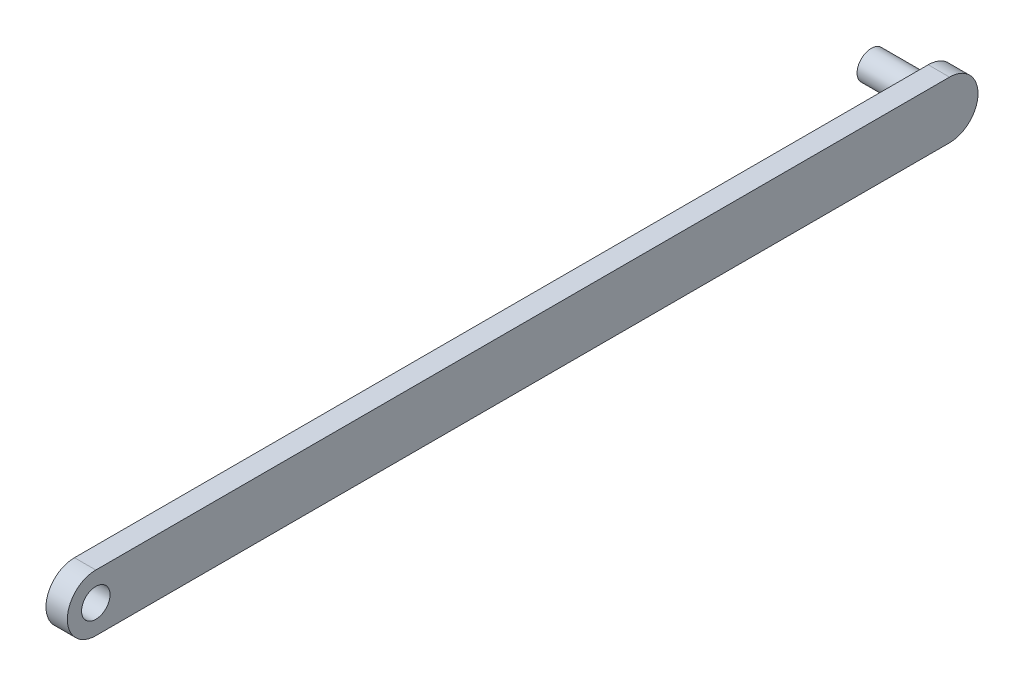
ISO-10303-21;
HEADER;
FILE_DESCRIPTION(('STEP AP214'),'2;1');
FILE_NAME('part.step','',(''),(''),'','','');
FILE_SCHEMA(('AUTOMOTIVE_DESIGN { 1 0 10303 214 1 1 1 1 }'));
ENDSEC;
DATA;
#1=APPLICATION_CONTEXT('core data for automotive mechanical design processes');
#2=APPLICATION_PROTOCOL_DEFINITION('international standard','automotive_design',2000,#1);
#3=PRODUCT_CONTEXT('',#1,'mechanical');
#4=PRODUCT('Part','Part','',(#3));
#5=PRODUCT_RELATED_PRODUCT_CATEGORY('part','',(#4));
#6=PRODUCT_DEFINITION_FORMATION('','',#4);
#7=PRODUCT_DEFINITION_CONTEXT('part definition',#1,'design');
#8=PRODUCT_DEFINITION('design','',#6,#7);
#9=PRODUCT_DEFINITION_SHAPE('','',#8);
#10=(LENGTH_UNIT() NAMED_UNIT(*) SI_UNIT(.MILLI.,.METRE.));
#11=(NAMED_UNIT(*) PLANE_ANGLE_UNIT() SI_UNIT($,.RADIAN.));
#12=(NAMED_UNIT(*) SI_UNIT($,.STERADIAN.) SOLID_ANGLE_UNIT());
#13=UNCERTAINTY_MEASURE_WITH_UNIT(LENGTH_MEASURE(1.E-05),#10,'distance_accuracy_value','');
#14=(GEOMETRIC_REPRESENTATION_CONTEXT(3) GLOBAL_UNCERTAINTY_ASSIGNED_CONTEXT((#13)) GLOBAL_UNIT_ASSIGNED_CONTEXT((#10,
#11,#12)) REPRESENTATION_CONTEXT('',''));
#15=CARTESIAN_POINT('',(0.,0.,0.));
#16=DIRECTION('',(0.,0.,1.));
#17=DIRECTION('',(1.,0.,0.));
#18=AXIS2_PLACEMENT_3D('',#15,#16,#17);
#19=CARTESIAN_POINT('',(9.525,0.,0.));
#20=DIRECTION('',(1.,0.,0.));
#21=DIRECTION('',(0.,0.,-1.));
#22=AXIS2_PLACEMENT_3D('',#19,#20,#21);
#23=PLANE('',#22);
#24=CARTESIAN_POINT('',(9.525,0.,0.));
#25=DIRECTION('',(1.,0.,0.));
#26=DIRECTION('',(0.,0.,-1.));
#27=AXIS2_PLACEMENT_3D('',#24,#25,#26);
#28=CIRCLE('',#27,12.7);
#29=CARTESIAN_POINT('',(9.525,12.7,0.));
#30=VERTEX_POINT('',#29);
#31=CARTESIAN_POINT('',(9.525,-12.7,0.));
#32=VERTEX_POINT('',#31);
#33=EDGE_CURVE('E86',#30,#32,#28,.T.);
#34=ORIENTED_EDGE('',*,*,#33,.T.);
#35=DIRECTION('',(0.,0.,-1.));
#36=VECTOR('',#35,1.);
#37=CARTESIAN_POINT('',(9.525,-12.7,0.));
#38=LINE('',#37,#36);
#39=CARTESIAN_POINT('',(9.525,-12.7,-381.));
#40=VERTEX_POINT('',#39);
#41=EDGE_CURVE('E81',#32,#40,#38,.T.);
#42=ORIENTED_EDGE('',*,*,#41,.T.);
#43=CARTESIAN_POINT('',(9.525,0.,-381.));
#44=DIRECTION('',(1.,0.,0.));
#45=DIRECTION('',(0.,0.,-1.));
#46=AXIS2_PLACEMENT_3D('',#43,#44,#45);
#47=CIRCLE('',#46,12.7);
#48=CARTESIAN_POINT('',(9.525,12.7,-381.));
#49=VERTEX_POINT('',#48);
#50=EDGE_CURVE('E84',#40,#49,#47,.T.);
#51=ORIENTED_EDGE('',*,*,#50,.T.);
#52=DIRECTION('',(0.,0.,1.));
#53=VECTOR('',#52,1.);
#54=CARTESIAN_POINT('',(9.525,12.7,0.));
#55=LINE('',#54,#53);
#56=EDGE_CURVE('E50',#49,#30,#55,.T.);
#57=ORIENTED_EDGE('',*,*,#56,.T.);
#58=EDGE_LOOP('',(#34,#42,#51,#57));
#59=FACE_BOUND('',#58,.T.);
#60=CARTESIAN_POINT('',(9.525,0.,0.));
#61=DIRECTION('',(1.,0.,0.));
#62=DIRECTION('',(0.,0.,-1.));
#63=AXIS2_PLACEMENT_3D('',#60,#61,#62);
#64=CIRCLE('',#63,6.35);
#65=CARTESIAN_POINT('',(9.525,0.,6.35));
#66=VERTEX_POINT('',#65);
#67=EDGE_CURVE('E103',#66,#66,#64,.T.);
#68=ORIENTED_EDGE('',*,*,#67,.F.);
#69=EDGE_LOOP('',(#68));
#70=FACE_BOUND('',#69,.T.);
#71=ADVANCED_FACE('F33',(#59,#70),#23,.T.);
#72=CARTESIAN_POINT('',(0.,0.,0.));
#73=DIRECTION('',(1.,0.,0.));
#74=DIRECTION('',(0.,0.,-1.));
#75=AXIS2_PLACEMENT_3D('',#72,#73,#74);
#76=PLANE('',#75);
#77=CARTESIAN_POINT('',(0.,0.,-381.));
#78=DIRECTION('',(1.,0.,0.));
#79=DIRECTION('',(0.,0.,-1.));
#80=AXIS2_PLACEMENT_3D('',#77,#78,#79);
#81=CIRCLE('',#80,6.35);
#82=CARTESIAN_POINT('',(0.,0.,-387.35));
#83=VERTEX_POINT('',#82);
#84=EDGE_CURVE('E11',#83,#83,#81,.F.);
#85=ORIENTED_EDGE('',*,*,#84,.F.);
#86=EDGE_LOOP('',(#85));
#87=FACE_BOUND('',#86,.T.);
#88=CARTESIAN_POINT('',(0.,0.,0.));
#89=DIRECTION('',(1.,0.,0.));
#90=DIRECTION('',(0.,0.,-1.));
#91=AXIS2_PLACEMENT_3D('',#88,#89,#90);
#92=CIRCLE('',#91,12.7);
#93=CARTESIAN_POINT('',(0.,12.7,0.));
#94=VERTEX_POINT('',#93);
#95=CARTESIAN_POINT('',(0.,-12.7,0.));
#96=VERTEX_POINT('',#95);
#97=EDGE_CURVE('E100',#94,#96,#92,.T.);
#98=ORIENTED_EDGE('',*,*,#97,.F.);
#99=DIRECTION('',(0.,0.,1.));
#100=VECTOR('',#99,1.);
#101=CARTESIAN_POINT('',(0.,12.7,0.));
#102=LINE('',#101,#100);
#103=CARTESIAN_POINT('',(0.,12.7,-381.));
#104=VERTEX_POINT('',#103);
#105=EDGE_CURVE('E73',#104,#94,#102,.T.);
#106=ORIENTED_EDGE('',*,*,#105,.F.);
#107=CARTESIAN_POINT('',(0.,0.,-381.));
#108=DIRECTION('',(1.,0.,0.));
#109=DIRECTION('',(0.,0.,-1.));
#110=AXIS2_PLACEMENT_3D('',#107,#108,#109);
#111=CIRCLE('',#110,12.7);
#112=CARTESIAN_POINT('',(0.,-12.7,-381.));
#113=VERTEX_POINT('',#112);
#114=EDGE_CURVE('E67',#113,#104,#111,.T.);
#115=ORIENTED_EDGE('',*,*,#114,.F.);
#116=DIRECTION('',(0.,0.,-1.));
#117=VECTOR('',#116,1.);
#118=CARTESIAN_POINT('',(0.,-12.7,0.));
#119=LINE('',#118,#117);
#120=EDGE_CURVE('E91',#96,#113,#119,.T.);
#121=ORIENTED_EDGE('',*,*,#120,.F.);
#122=EDGE_LOOP('',(#98,#106,#115,#121));
#123=FACE_BOUND('',#122,.T.);
#124=CARTESIAN_POINT('',(0.,0.,0.));
#125=DIRECTION('',(1.,0.,0.));
#126=DIRECTION('',(0.,0.,-1.));
#127=AXIS2_PLACEMENT_3D('',#124,#125,#126);
#128=CIRCLE('',#127,6.35);
#129=CARTESIAN_POINT('',(0.,0.,6.35));
#130=VERTEX_POINT('',#129);
#131=EDGE_CURVE('E118',#130,#130,#128,.T.);
#132=ORIENTED_EDGE('',*,*,#131,.T.);
#133=EDGE_LOOP('',(#132));
#134=FACE_BOUND('',#133,.T.);
#135=ADVANCED_FACE('F111',(#87,#123,#134),#76,.F.);
#136=CARTESIAN_POINT('',(9.525,0.,0.));
#137=DIRECTION('',(-1.,0.,0.));
#138=DIRECTION('',(0.,0.,1.));
#139=AXIS2_PLACEMENT_3D('',#136,#137,#138);
#140=CYLINDRICAL_SURFACE('',#139,12.7);
#141=ORIENTED_EDGE('',*,*,#97,.T.);
#142=DIRECTION('',(-1.,0.,0.));
#143=VECTOR('',#142,1.);
#144=CARTESIAN_POINT('',(9.525,-12.7,0.));
#145=LINE('',#144,#143);
#146=EDGE_CURVE('E42',#32,#96,#145,.T.);
#147=ORIENTED_EDGE('',*,*,#146,.F.);
#148=ORIENTED_EDGE('',*,*,#33,.F.);
#149=DIRECTION('',(-1.,0.,0.));
#150=VECTOR('',#149,1.);
#151=CARTESIAN_POINT('',(9.525,12.7,0.));
#152=LINE('',#151,#150);
#153=EDGE_CURVE('E96',#30,#94,#152,.T.);
#154=ORIENTED_EDGE('',*,*,#153,.T.);
#155=EDGE_LOOP('',(#141,#147,#148,#154));
#156=FACE_BOUND('',#155,.T.);
#157=ADVANCED_FACE('F35',(#156),#140,.T.);
#158=CARTESIAN_POINT('',(9.525,-12.7,0.));
#159=DIRECTION('',(0.,1.,0.));
#160=DIRECTION('',(0.,0.,1.));
#161=AXIS2_PLACEMENT_3D('',#158,#159,#160);
#162=PLANE('',#161);
#163=ORIENTED_EDGE('',*,*,#120,.T.);
#164=DIRECTION('',(-1.,0.,0.));
#165=VECTOR('',#164,1.);
#166=CARTESIAN_POINT('',(9.525,-12.7,-381.));
#167=LINE('',#166,#165);
#168=EDGE_CURVE('E89',#40,#113,#167,.T.);
#169=ORIENTED_EDGE('',*,*,#168,.F.);
#170=ORIENTED_EDGE('',*,*,#41,.F.);
#171=ORIENTED_EDGE('',*,*,#146,.T.);
#172=EDGE_LOOP('',(#163,#169,#170,#171));
#173=FACE_BOUND('',#172,.T.);
#174=ADVANCED_FACE('F90',(#173),#162,.F.);
#175=CARTESIAN_POINT('',(9.525,0.,-381.));
#176=DIRECTION('',(-1.,0.,0.));
#177=DIRECTION('',(0.,0.,1.));
#178=AXIS2_PLACEMENT_3D('',#175,#176,#177);
#179=CYLINDRICAL_SURFACE('',#178,12.7);
#180=ORIENTED_EDGE('',*,*,#114,.T.);
#181=DIRECTION('',(-1.,0.,0.));
#182=VECTOR('',#181,1.);
#183=CARTESIAN_POINT('',(9.525,12.7,-381.));
#184=LINE('',#183,#182);
#185=EDGE_CURVE('E92',#49,#104,#184,.T.);
#186=ORIENTED_EDGE('',*,*,#185,.F.);
#187=ORIENTED_EDGE('',*,*,#50,.F.);
#188=ORIENTED_EDGE('',*,*,#168,.T.);
#189=EDGE_LOOP('',(#180,#186,#187,#188));
#190=FACE_BOUND('',#189,.T.);
#191=ADVANCED_FACE('F94',(#190),#179,.T.);
#192=CARTESIAN_POINT('',(9.525,12.7,0.));
#193=DIRECTION('',(0.,-1.,0.));
#194=DIRECTION('',(0.,0.,-1.));
#195=AXIS2_PLACEMENT_3D('',#192,#193,#194);
#196=PLANE('',#195);
#197=ORIENTED_EDGE('',*,*,#105,.T.);
#198=ORIENTED_EDGE('',*,*,#153,.F.);
#199=ORIENTED_EDGE('',*,*,#56,.F.);
#200=ORIENTED_EDGE('',*,*,#185,.T.);
#201=EDGE_LOOP('',(#197,#198,#199,#200));
#202=FACE_BOUND('',#201,.T.);
#203=ADVANCED_FACE('F141',(#202),#196,.F.);
#204=CARTESIAN_POINT('',(9.525,0.,0.));
#205=DIRECTION('',(-1.,0.,0.));
#206=DIRECTION('',(0.,0.,1.));
#207=AXIS2_PLACEMENT_3D('',#204,#205,#206);
#208=CYLINDRICAL_SURFACE('',#207,6.35);
#209=CARTESIAN_POINT('',(9.525,0.,6.35));
#210=CARTESIAN_POINT('',(9.42578125,0.,6.35));
#211=CARTESIAN_POINT('',(9.3265625,0.,6.35));
#212=CARTESIAN_POINT('',(9.128125,0.,6.35));
#213=CARTESIAN_POINT('',(9.02890625,0.,6.35));
#214=CARTESIAN_POINT('',(8.83046875,0.,6.35));
#215=CARTESIAN_POINT('',(8.73125,0.,6.35));
#216=CARTESIAN_POINT('',(8.5328125,0.,6.35));
#217=CARTESIAN_POINT('',(8.43359375,0.,6.35));
#218=CARTESIAN_POINT('',(8.23515625,0.,6.35));
#219=CARTESIAN_POINT('',(8.1359375,0.,6.35));
#220=CARTESIAN_POINT('',(7.9375,0.,6.35));
#221=CARTESIAN_POINT('',(7.83828125,0.,6.35));
#222=CARTESIAN_POINT('',(7.63984375,0.,6.35));
#223=CARTESIAN_POINT('',(7.540625,0.,6.35));
#224=CARTESIAN_POINT('',(7.3421875,0.,6.35));
#225=CARTESIAN_POINT('',(7.24296875,0.,6.35));
#226=CARTESIAN_POINT('',(7.04453125,0.,6.35));
#227=CARTESIAN_POINT('',(6.9453125,0.,6.35));
#228=CARTESIAN_POINT('',(6.746875,0.,6.35));
#229=CARTESIAN_POINT('',(6.64765625,0.,6.35));
#230=CARTESIAN_POINT('',(6.44921875,0.,6.35));
#231=CARTESIAN_POINT('',(6.35,0.,6.35));
#232=CARTESIAN_POINT('',(6.1515625,0.,6.35));
#233=CARTESIAN_POINT('',(6.05234375,0.,6.35));
#234=CARTESIAN_POINT('',(5.85390625,0.,6.35));
#235=CARTESIAN_POINT('',(5.7546875,0.,6.35));
#236=CARTESIAN_POINT('',(5.55625,0.,6.35));
#237=CARTESIAN_POINT('',(5.45703125,0.,6.35));
#238=CARTESIAN_POINT('',(5.25859375,0.,6.35));
#239=CARTESIAN_POINT('',(5.159375,0.,6.35));
#240=CARTESIAN_POINT('',(4.9609375,0.,6.35));
#241=CARTESIAN_POINT('',(4.86171875,0.,6.35));
#242=CARTESIAN_POINT('',(4.66328125,0.,6.35));
#243=CARTESIAN_POINT('',(4.5640625,0.,6.35));
#244=CARTESIAN_POINT('',(4.365625,0.,6.35));
#245=CARTESIAN_POINT('',(4.26640625,0.,6.35));
#246=CARTESIAN_POINT('',(4.06796875,0.,6.35));
#247=CARTESIAN_POINT('',(3.96875,0.,6.35));
#248=CARTESIAN_POINT('',(3.7703125,0.,6.35));
#249=CARTESIAN_POINT('',(3.67109375,0.,6.35));
#250=CARTESIAN_POINT('',(3.47265625,0.,6.35));
#251=CARTESIAN_POINT('',(3.3734375,0.,6.35));
#252=CARTESIAN_POINT('',(3.175,0.,6.35));
#253=CARTESIAN_POINT('',(3.07578125,0.,6.35));
#254=CARTESIAN_POINT('',(2.87734375,0.,6.35));
#255=CARTESIAN_POINT('',(2.778125,0.,6.35));
#256=CARTESIAN_POINT('',(2.5796875,0.,6.35));
#257=CARTESIAN_POINT('',(2.48046875,0.,6.35));
#258=CARTESIAN_POINT('',(2.28203125,0.,6.35));
#259=CARTESIAN_POINT('',(2.1828125,0.,6.35));
#260=CARTESIAN_POINT('',(1.984375,0.,6.35));
#261=CARTESIAN_POINT('',(1.88515625,0.,6.35));
#262=CARTESIAN_POINT('',(1.68671875,0.,6.35));
#263=CARTESIAN_POINT('',(1.5875,0.,6.35));
#264=CARTESIAN_POINT('',(1.3890625,0.,6.35));
#265=CARTESIAN_POINT('',(1.28984375,0.,6.35));
#266=CARTESIAN_POINT('',(1.09140625,0.,6.35));
#267=CARTESIAN_POINT('',(0.992187500000001,0.,6.35));
#268=CARTESIAN_POINT('',(0.793750000000001,0.,6.35));
#269=CARTESIAN_POINT('',(0.69453125,0.,6.35));
#270=CARTESIAN_POINT('',(0.49609375,0.,6.35));
#271=CARTESIAN_POINT('',(0.396875,0.,6.35));
#272=CARTESIAN_POINT('',(0.1984375,0.,6.35));
#273=CARTESIAN_POINT('',(0.0992187500000001,0.,6.35));
#274=CARTESIAN_POINT('',(0.,0.,6.35));
#275=B_SPLINE_CURVE_WITH_KNOTS('',3,(#209,#210,#211,#212,#213,#214,#215,#216,#217,#218,#219,
#220,#221,#222,#223,#224,#225,#226,#227,#228,#229,#230,#231,#232,#233,#234,#235,#236,#237,#238,
#239,#240,#241,#242,#243,#244,#245,#246,#247,#248,#249,#250,#251,#252,#253,#254,#255,#256,#257,
#258,#259,#260,#261,#262,#263,#264,#265,#266,#267,#268,#269,#270,#271,#272,#273,#274),
.UNSPECIFIED.,.F.,.F.,(4,2,2,2,2,2,2,2,2,2,2,2,2,2,2,2,2,2,2,2,2,2,2,2,2,2,2,2,2,2,2,2,4),(0.,
0.297656249999998,0.595312499999999,0.892968749999999,1.190625,1.48828125,1.7859375,2.08359375,
2.38125,2.67890625,2.9765625,3.27421875,3.571875,3.86953125,4.1671875,4.46484375,4.7625,
5.06015625,5.3578125,5.65546875,5.953125,6.25078125,6.5484375,6.84609375,7.14375,7.44140625,
7.7390625,8.03671875,8.334375,8.63203125,8.9296875,9.22734375,9.525),.UNSPECIFIED.);
#276=EDGE_CURVE('BSEAM133',#66,#130,#275,.T.);
#277=ORIENTED_EDGE('',*,*,#67,.T.);
#278=ORIENTED_EDGE('',*,*,#131,.F.);
#279=ORIENTED_EDGE('',*,*,#276,.T.);
#280=ORIENTED_EDGE('',*,*,#276,.F.);
#281=EDGE_LOOP('',(#277,#279,#278,#280));
#282=FACE_BOUND('',#281,.T.);
#283=ADVANCED_FACE('F133',(#282),#208,.F.);
#284=CARTESIAN_POINT('',(-25.4,0.,-381.));
#285=DIRECTION('',(1.,0.,0.));
#286=DIRECTION('',(0.,0.,-1.));
#287=AXIS2_PLACEMENT_3D('',#284,#285,#286);
#288=CYLINDRICAL_SURFACE('',#287,6.35);
#289=CARTESIAN_POINT('',(-25.4,0.,-381.));
#290=DIRECTION('',(-1.,0.,0.));
#291=DIRECTION('',(0.,0.,1.));
#292=AXIS2_PLACEMENT_3D('',#289,#290,#291);
#293=CIRCLE('',#292,6.35);
#294=CARTESIAN_POINT('',(-25.4,0.,-374.65));
#295=VERTEX_POINT('',#294);
#296=EDGE_CURVE('E120',#295,#295,#293,.T.);
#297=ORIENTED_EDGE('',*,*,#296,.F.);
#298=EDGE_LOOP('',(#297));
#299=FACE_BOUND('',#298,.T.);
#300=ORIENTED_EDGE('',*,*,#84,.T.);
#301=EDGE_LOOP('',(#300));
#302=FACE_BOUND('',#301,.T.);
#303=ADVANCED_FACE('F130',(#299,#302),#288,.T.);
#304=CARTESIAN_POINT('',(-25.4,0.,-381.));
#305=DIRECTION('',(-1.,0.,0.));
#306=DIRECTION('',(0.,0.,1.));
#307=AXIS2_PLACEMENT_3D('',#304,#305,#306);
#308=PLANE('',#307);
#309=ORIENTED_EDGE('',*,*,#296,.T.);
#310=EDGE_LOOP('',(#309));
#311=FACE_BOUND('',#310,.T.);
#312=ADVANCED_FACE('F128',(#311),#308,.T.);
#313=CLOSED_SHELL('',(#71,#135,#157,#174,#191,#203,#283,#303,#312));
#314=MANIFOLD_SOLID_BREP('B2',#313);
#315=ADVANCED_BREP_SHAPE_REPRESENTATION('',(#18,#314),#14);
#316=SHAPE_DEFINITION_REPRESENTATION(#9,#315);
ENDSEC;
END-ISO-10303-21;
